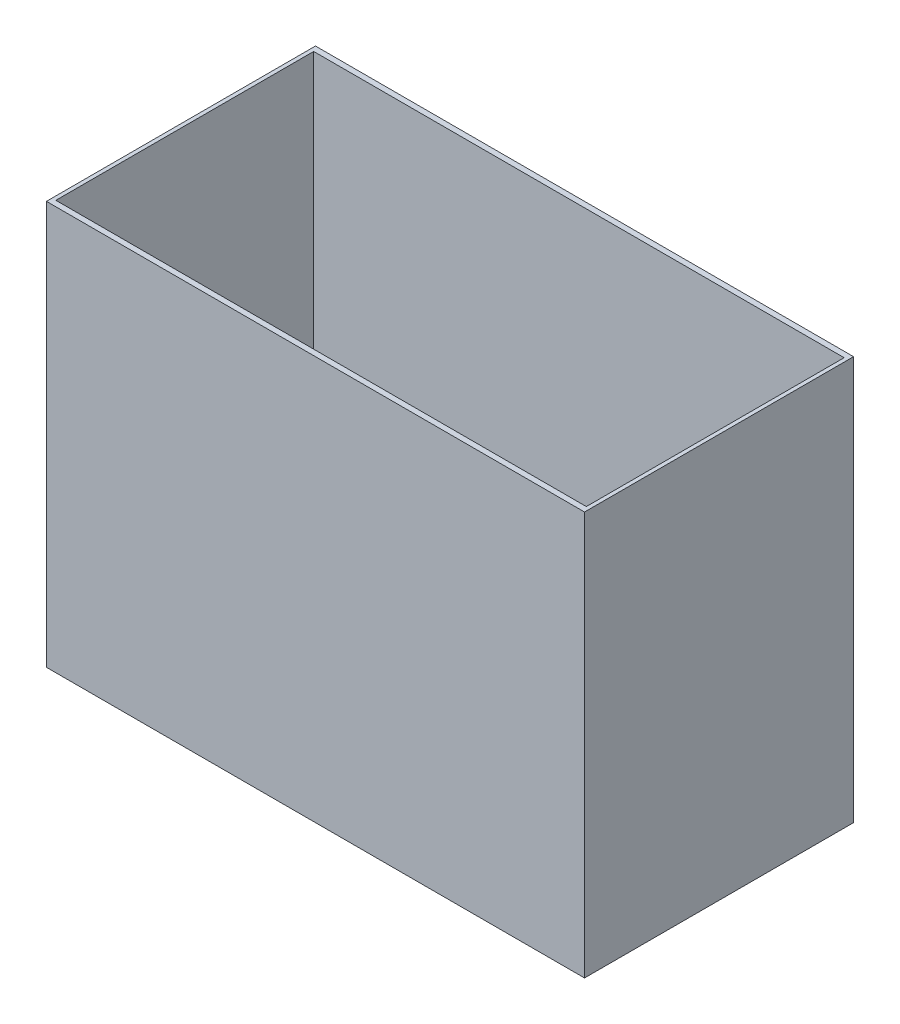
ISO-10303-21;
HEADER;
FILE_DESCRIPTION(('STEP AP214'),'2;1');
FILE_NAME('part.step','',(''),(''),'','','');
FILE_SCHEMA(('AUTOMOTIVE_DESIGN { 1 0 10303 214 1 1 1 1 }'));
ENDSEC;
DATA;
#1=APPLICATION_CONTEXT('core data for automotive mechanical design processes');
#2=APPLICATION_PROTOCOL_DEFINITION('international standard','automotive_design',2000,#1);
#3=PRODUCT_CONTEXT('',#1,'mechanical');
#4=PRODUCT('Part','Part','',(#3));
#5=PRODUCT_RELATED_PRODUCT_CATEGORY('part','',(#4));
#6=PRODUCT_DEFINITION_FORMATION('','',#4);
#7=PRODUCT_DEFINITION_CONTEXT('part definition',#1,'design');
#8=PRODUCT_DEFINITION('design','',#6,#7);
#9=PRODUCT_DEFINITION_SHAPE('','',#8);
#10=(LENGTH_UNIT() NAMED_UNIT(*) SI_UNIT(.MILLI.,.METRE.));
#11=(NAMED_UNIT(*) PLANE_ANGLE_UNIT() SI_UNIT($,.RADIAN.));
#12=(NAMED_UNIT(*) SI_UNIT($,.STERADIAN.) SOLID_ANGLE_UNIT());
#13=UNCERTAINTY_MEASURE_WITH_UNIT(LENGTH_MEASURE(1.E-05),#10,'distance_accuracy_value','');
#14=(GEOMETRIC_REPRESENTATION_CONTEXT(3) GLOBAL_UNCERTAINTY_ASSIGNED_CONTEXT((#13)) GLOBAL_UNIT_ASSIGNED_CONTEXT((#10,
#11,#12)) REPRESENTATION_CONTEXT('',''));
#15=CARTESIAN_POINT('',(0.,0.,0.));
#16=DIRECTION('',(0.,0.,1.));
#17=DIRECTION('',(1.,0.,0.));
#18=AXIS2_PLACEMENT_3D('',#15,#16,#17);
#19=CARTESIAN_POINT('',(0.,457.2,0.));
#20=DIRECTION('',(0.,-1.,0.));
#21=DIRECTION('',(0.,0.,-1.));
#22=AXIS2_PLACEMENT_3D('',#19,#20,#21);
#23=PLANE('',#22);
#24=DIRECTION('',(0.,0.,-1.));
#25=VECTOR('',#24,1.);
#26=CARTESIAN_POINT('',(304.8,457.2,152.4));
#27=LINE('',#26,#25);
#28=CARTESIAN_POINT('',(304.8,457.2,152.4));
#29=VERTEX_POINT('',#28);
#30=CARTESIAN_POINT('',(304.8,457.2,-152.4));
#31=VERTEX_POINT('',#30);
#32=EDGE_CURVE('E151',#29,#31,#27,.T.);
#33=ORIENTED_EDGE('',*,*,#32,.T.);
#34=DIRECTION('',(-1.,0.,0.));
#35=VECTOR('',#34,1.);
#36=CARTESIAN_POINT('',(-304.8,457.2,-152.4));
#37=LINE('',#36,#35);
#38=CARTESIAN_POINT('',(-304.8,457.2,-152.4));
#39=VERTEX_POINT('',#38);
#40=EDGE_CURVE('E154',#31,#39,#37,.T.);
#41=ORIENTED_EDGE('',*,*,#40,.T.);
#42=DIRECTION('',(0.,0.,1.));
#43=VECTOR('',#42,1.);
#44=CARTESIAN_POINT('',(-304.8,457.2,152.4));
#45=LINE('',#44,#43);
#46=CARTESIAN_POINT('',(-304.8,457.2,152.4));
#47=VERTEX_POINT('',#46);
#48=EDGE_CURVE('E157',#39,#47,#45,.T.);
#49=ORIENTED_EDGE('',*,*,#48,.T.);
#50=DIRECTION('',(1.,0.,0.));
#51=VECTOR('',#50,1.);
#52=CARTESIAN_POINT('',(-304.8,457.2,152.4));
#53=LINE('',#52,#51);
#54=EDGE_CURVE('E159',#47,#29,#53,.T.);
#55=ORIENTED_EDGE('',*,*,#54,.T.);
#56=EDGE_LOOP('',(#33,#41,#49,#55));
#57=FACE_BOUND('',#56,.T.);
#58=DIRECTION('',(0.,0.,-1.));
#59=VECTOR('',#58,1.);
#60=CARTESIAN_POINT('',(300.482,457.2,146.05));
#61=LINE('',#60,#59);
#62=CARTESIAN_POINT('',(300.482,457.2,146.05));
#63=VERTEX_POINT('',#62);
#64=CARTESIAN_POINT('',(300.482,457.2,-146.05));
#65=VERTEX_POINT('',#64);
#66=EDGE_CURVE('E115',#63,#65,#61,.T.);
#67=ORIENTED_EDGE('',*,*,#66,.F.);
#68=DIRECTION('',(1.,0.,0.));
#69=VECTOR('',#68,1.);
#70=CARTESIAN_POINT('',(-300.482,457.2,146.05));
#71=LINE('',#70,#69);
#72=CARTESIAN_POINT('',(-300.482,457.2,146.05));
#73=VERTEX_POINT('',#72);
#74=EDGE_CURVE('E137',#73,#63,#71,.T.);
#75=ORIENTED_EDGE('',*,*,#74,.F.);
#76=DIRECTION('',(0.,0.,1.));
#77=VECTOR('',#76,1.);
#78=CARTESIAN_POINT('',(-300.482,457.2,146.05));
#79=LINE('',#78,#77);
#80=CARTESIAN_POINT('',(-300.482,457.2,-146.05));
#81=VERTEX_POINT('',#80);
#82=EDGE_CURVE('E135',#81,#73,#79,.T.);
#83=ORIENTED_EDGE('',*,*,#82,.F.);
#84=DIRECTION('',(-1.,0.,0.));
#85=VECTOR('',#84,1.);
#86=CARTESIAN_POINT('',(-300.482,457.2,-146.05));
#87=LINE('',#86,#85);
#88=EDGE_CURVE('E123',#65,#81,#87,.T.);
#89=ORIENTED_EDGE('',*,*,#88,.F.);
#90=EDGE_LOOP('',(#67,#75,#83,#89));
#91=FACE_BOUND('',#90,.T.);
#92=ADVANCED_FACE('F50',(#57,#91),#23,.F.);
#93=CARTESIAN_POINT('',(0.,0.,0.));
#94=DIRECTION('',(0.,-1.,0.));
#95=DIRECTION('',(0.,0.,-1.));
#96=AXIS2_PLACEMENT_3D('',#93,#94,#95);
#97=PLANE('',#96);
#98=DIRECTION('',(0.,0.,-1.));
#99=VECTOR('',#98,1.);
#100=CARTESIAN_POINT('',(304.8,0.,152.4));
#101=LINE('',#100,#99);
#102=CARTESIAN_POINT('',(304.8,0.,152.4));
#103=VERTEX_POINT('',#102);
#104=CARTESIAN_POINT('',(304.8,0.,-152.4));
#105=VERTEX_POINT('',#104);
#106=EDGE_CURVE('E131',#103,#105,#101,.T.);
#107=ORIENTED_EDGE('',*,*,#106,.F.);
#108=DIRECTION('',(1.,0.,0.));
#109=VECTOR('',#108,1.);
#110=CARTESIAN_POINT('',(-304.8,0.,152.4));
#111=LINE('',#110,#109);
#112=CARTESIAN_POINT('',(-304.8,0.,152.4));
#113=VERTEX_POINT('',#112);
#114=EDGE_CURVE('E155',#113,#103,#111,.T.);
#115=ORIENTED_EDGE('',*,*,#114,.F.);
#116=DIRECTION('',(0.,0.,1.));
#117=VECTOR('',#116,1.);
#118=CARTESIAN_POINT('',(-304.8,0.,152.4));
#119=LINE('',#118,#117);
#120=CARTESIAN_POINT('',(-304.8,0.,-152.4));
#121=VERTEX_POINT('',#120);
#122=EDGE_CURVE('E166',#121,#113,#119,.T.);
#123=ORIENTED_EDGE('',*,*,#122,.F.);
#124=DIRECTION('',(-1.,0.,0.));
#125=VECTOR('',#124,1.);
#126=CARTESIAN_POINT('',(-304.8,0.,-152.4));
#127=LINE('',#126,#125);
#128=EDGE_CURVE('E164',#105,#121,#127,.T.);
#129=ORIENTED_EDGE('',*,*,#128,.F.);
#130=EDGE_LOOP('',(#107,#115,#123,#129));
#131=FACE_BOUND('',#130,.T.);
#132=DIRECTION('',(1.,0.,0.));
#133=VECTOR('',#132,1.);
#134=CARTESIAN_POINT('',(-300.482,0.,146.05));
#135=LINE('',#134,#133);
#136=CARTESIAN_POINT('',(-300.482,0.,146.05));
#137=VERTEX_POINT('',#136);
#138=CARTESIAN_POINT('',(300.482,0.,146.05));
#139=VERTEX_POINT('',#138);
#140=EDGE_CURVE('E124',#137,#139,#135,.T.);
#141=ORIENTED_EDGE('',*,*,#140,.T.);
#142=DIRECTION('',(0.,0.,-1.));
#143=VECTOR('',#142,1.);
#144=CARTESIAN_POINT('',(300.482,0.,146.05));
#145=LINE('',#144,#143);
#146=CARTESIAN_POINT('',(300.482,0.,-146.05));
#147=VERTEX_POINT('',#146);
#148=EDGE_CURVE('E73',#139,#147,#145,.T.);
#149=ORIENTED_EDGE('',*,*,#148,.T.);
#150=DIRECTION('',(-1.,0.,0.));
#151=VECTOR('',#150,1.);
#152=CARTESIAN_POINT('',(-300.482,0.,-146.05));
#153=LINE('',#152,#151);
#154=CARTESIAN_POINT('',(-300.482,0.,-146.05));
#155=VERTEX_POINT('',#154);
#156=EDGE_CURVE('E130',#147,#155,#153,.T.);
#157=ORIENTED_EDGE('',*,*,#156,.T.);
#158=DIRECTION('',(0.,0.,1.));
#159=VECTOR('',#158,1.);
#160=CARTESIAN_POINT('',(-300.482,0.,146.05));
#161=LINE('',#160,#159);
#162=EDGE_CURVE('E143',#155,#137,#161,.T.);
#163=ORIENTED_EDGE('',*,*,#162,.T.);
#164=EDGE_LOOP('',(#141,#149,#157,#163));
#165=FACE_BOUND('',#164,.T.);
#166=ADVANCED_FACE('F184',(#131,#165),#97,.T.);
#167=CARTESIAN_POINT('',(304.8,457.2,152.4));
#168=DIRECTION('',(-1.,0.,0.));
#169=DIRECTION('',(0.,0.,1.));
#170=AXIS2_PLACEMENT_3D('',#167,#168,#169);
#171=PLANE('',#170);
#172=ORIENTED_EDGE('',*,*,#106,.T.);
#173=DIRECTION('',(0.,-1.,0.));
#174=VECTOR('',#173,1.);
#175=CARTESIAN_POINT('',(304.8,457.2,-152.4));
#176=LINE('',#175,#174);
#177=EDGE_CURVE('E12',#31,#105,#176,.T.);
#178=ORIENTED_EDGE('',*,*,#177,.F.);
#179=ORIENTED_EDGE('',*,*,#32,.F.);
#180=DIRECTION('',(0.,-1.,0.));
#181=VECTOR('',#180,1.);
#182=CARTESIAN_POINT('',(304.8,457.2,152.4));
#183=LINE('',#182,#181);
#184=EDGE_CURVE('E161',#29,#103,#183,.T.);
#185=ORIENTED_EDGE('',*,*,#184,.T.);
#186=EDGE_LOOP('',(#172,#178,#179,#185));
#187=FACE_BOUND('',#186,.T.);
#188=ADVANCED_FACE('F52',(#187),#171,.F.);
#189=CARTESIAN_POINT('',(-304.8,457.2,-152.4));
#190=DIRECTION('',(0.,0.,1.));
#191=DIRECTION('',(1.,0.,0.));
#192=AXIS2_PLACEMENT_3D('',#189,#190,#191);
#193=PLANE('',#192);
#194=ORIENTED_EDGE('',*,*,#128,.T.);
#195=DIRECTION('',(0.,-1.,0.));
#196=VECTOR('',#195,1.);
#197=CARTESIAN_POINT('',(-304.8,457.2,-152.4));
#198=LINE('',#197,#196);
#199=EDGE_CURVE('E58',#39,#121,#198,.T.);
#200=ORIENTED_EDGE('',*,*,#199,.F.);
#201=ORIENTED_EDGE('',*,*,#40,.F.);
#202=ORIENTED_EDGE('',*,*,#177,.T.);
#203=EDGE_LOOP('',(#194,#200,#201,#202));
#204=FACE_BOUND('',#203,.T.);
#205=ADVANCED_FACE('F194',(#204),#193,.F.);
#206=CARTESIAN_POINT('',(-304.8,457.2,152.4));
#207=DIRECTION('',(1.,0.,0.));
#208=DIRECTION('',(0.,0.,-1.));
#209=AXIS2_PLACEMENT_3D('',#206,#207,#208);
#210=PLANE('',#209);
#211=ORIENTED_EDGE('',*,*,#122,.T.);
#212=DIRECTION('',(0.,-1.,0.));
#213=VECTOR('',#212,1.);
#214=CARTESIAN_POINT('',(-304.8,457.2,152.4));
#215=LINE('',#214,#213);
#216=EDGE_CURVE('E171',#47,#113,#215,.T.);
#217=ORIENTED_EDGE('',*,*,#216,.F.);
#218=ORIENTED_EDGE('',*,*,#48,.F.);
#219=ORIENTED_EDGE('',*,*,#199,.T.);
#220=EDGE_LOOP('',(#211,#217,#218,#219));
#221=FACE_BOUND('',#220,.T.);
#222=ADVANCED_FACE('F178',(#221),#210,.F.);
#223=CARTESIAN_POINT('',(-304.8,457.2,152.4));
#224=DIRECTION('',(0.,0.,-1.));
#225=DIRECTION('',(-1.,0.,0.));
#226=AXIS2_PLACEMENT_3D('',#223,#224,#225);
#227=PLANE('',#226);
#228=ORIENTED_EDGE('',*,*,#114,.T.);
#229=ORIENTED_EDGE('',*,*,#184,.F.);
#230=ORIENTED_EDGE('',*,*,#54,.F.);
#231=ORIENTED_EDGE('',*,*,#216,.T.);
#232=EDGE_LOOP('',(#228,#229,#230,#231));
#233=FACE_BOUND('',#232,.T.);
#234=ADVANCED_FACE('F188',(#233),#227,.F.);
#235=CARTESIAN_POINT('',(300.482,457.2,146.05));
#236=DIRECTION('',(-1.,0.,0.));
#237=DIRECTION('',(0.,0.,1.));
#238=AXIS2_PLACEMENT_3D('',#235,#236,#237);
#239=PLANE('',#238);
#240=ORIENTED_EDGE('',*,*,#148,.F.);
#241=DIRECTION('',(0.,-1.,0.));
#242=VECTOR('',#241,1.);
#243=CARTESIAN_POINT('',(300.482,457.2,146.05));
#244=LINE('',#243,#242);
#245=EDGE_CURVE('E119',#63,#139,#244,.T.);
#246=ORIENTED_EDGE('',*,*,#245,.F.);
#247=ORIENTED_EDGE('',*,*,#66,.T.);
#248=DIRECTION('',(0.,-1.,0.));
#249=VECTOR('',#248,1.);
#250=CARTESIAN_POINT('',(300.482,457.2,-146.05));
#251=LINE('',#250,#249);
#252=EDGE_CURVE('E118',#65,#147,#251,.T.);
#253=ORIENTED_EDGE('',*,*,#252,.T.);
#254=EDGE_LOOP('',(#240,#246,#247,#253));
#255=FACE_BOUND('',#254,.T.);
#256=ADVANCED_FACE('F117',(#255),#239,.T.);
#257=CARTESIAN_POINT('',(-300.482,457.2,-146.05));
#258=DIRECTION('',(0.,0.,1.));
#259=DIRECTION('',(1.,0.,0.));
#260=AXIS2_PLACEMENT_3D('',#257,#258,#259);
#261=PLANE('',#260);
#262=ORIENTED_EDGE('',*,*,#156,.F.);
#263=ORIENTED_EDGE('',*,*,#252,.F.);
#264=ORIENTED_EDGE('',*,*,#88,.T.);
#265=DIRECTION('',(0.,-1.,0.));
#266=VECTOR('',#265,1.);
#267=CARTESIAN_POINT('',(-300.482,457.2,-146.05));
#268=LINE('',#267,#266);
#269=EDGE_CURVE('E132',#81,#155,#268,.T.);
#270=ORIENTED_EDGE('',*,*,#269,.T.);
#271=EDGE_LOOP('',(#262,#263,#264,#270));
#272=FACE_BOUND('',#271,.T.);
#273=ADVANCED_FACE('F127',(#272),#261,.T.);
#274=CARTESIAN_POINT('',(-300.482,457.2,146.05));
#275=DIRECTION('',(1.,0.,0.));
#276=DIRECTION('',(0.,0.,-1.));
#277=AXIS2_PLACEMENT_3D('',#274,#275,#276);
#278=PLANE('',#277);
#279=ORIENTED_EDGE('',*,*,#162,.F.);
#280=ORIENTED_EDGE('',*,*,#269,.F.);
#281=ORIENTED_EDGE('',*,*,#82,.T.);
#282=DIRECTION('',(0.,-1.,0.));
#283=VECTOR('',#282,1.);
#284=CARTESIAN_POINT('',(-300.482,457.2,146.05));
#285=LINE('',#284,#283);
#286=EDGE_CURVE('E65',#73,#137,#285,.T.);
#287=ORIENTED_EDGE('',*,*,#286,.T.);
#288=EDGE_LOOP('',(#279,#280,#281,#287));
#289=FACE_BOUND('',#288,.T.);
#290=ADVANCED_FACE('F217',(#289),#278,.T.);
#291=CARTESIAN_POINT('',(-300.482,457.2,146.05));
#292=DIRECTION('',(0.,0.,-1.));
#293=DIRECTION('',(-1.,0.,0.));
#294=AXIS2_PLACEMENT_3D('',#291,#292,#293);
#295=PLANE('',#294);
#296=ORIENTED_EDGE('',*,*,#140,.F.);
#297=ORIENTED_EDGE('',*,*,#286,.F.);
#298=ORIENTED_EDGE('',*,*,#74,.T.);
#299=ORIENTED_EDGE('',*,*,#245,.T.);
#300=EDGE_LOOP('',(#296,#297,#298,#299));
#301=FACE_BOUND('',#300,.T.);
#302=ADVANCED_FACE('F221',(#301),#295,.T.);
#303=CLOSED_SHELL('',(#92,#166,#188,#205,#222,#234,#256,#273,#290,#302));
#304=MANIFOLD_SOLID_BREP('B2_NOT_SHOWN',#303);
#305=CARTESIAN_POINT('',(292.1,6.35,-139.7));
#306=DIRECTION('',(-1.,0.,0.));
#307=DIRECTION('',(0.,0.,1.));
#308=AXIS2_PLACEMENT_3D('',#305,#306,#307);
#309=PLANE('',#308);
#310=DIRECTION('',(0.,0.,-1.));
#311=VECTOR('',#310,1.);
#312=CARTESIAN_POINT('',(292.1,0.,-139.7));
#313=LINE('',#312,#311);
#314=CARTESIAN_POINT('',(292.1,0.,139.7));
#315=VERTEX_POINT('',#314);
#316=CARTESIAN_POINT('',(292.1,0.,104.14));
#317=VERTEX_POINT('',#316);
#318=EDGE_CURVE('E550',#315,#317,#313,.T.);
#319=ORIENTED_EDGE('',*,*,#318,.T.);
#320=DIRECTION('',(0.,1.,0.));
#321=VECTOR('',#320,1.);
#322=CARTESIAN_POINT('',(292.1,0.,104.14));
#323=LINE('',#322,#321);
#324=CARTESIAN_POINT('',(292.1,6.35,104.14));
#325=VERTEX_POINT('',#324);
#326=EDGE_CURVE('E488',#317,#325,#323,.T.);
#327=ORIENTED_EDGE('',*,*,#326,.T.);
#328=DIRECTION('',(0.,0.,-1.));
#329=VECTOR('',#328,1.);
#330=CARTESIAN_POINT('',(292.1,6.35,-139.7));
#331=LINE('',#330,#329);
#332=CARTESIAN_POINT('',(292.1,6.35,139.7));
#333=VERTEX_POINT('',#332);
#334=EDGE_CURVE('E539',#333,#325,#331,.T.);
#335=ORIENTED_EDGE('',*,*,#334,.F.);
#336=DIRECTION('',(0.,-1.,0.));
#337=VECTOR('',#336,1.);
#338=CARTESIAN_POINT('',(292.1,6.35,139.7));
#339=LINE('',#338,#337);
#340=EDGE_CURVE('E549',#333,#315,#339,.T.);
#341=ORIENTED_EDGE('',*,*,#340,.T.);
#342=EDGE_LOOP('',(#319,#327,#335,#341));
#343=FACE_BOUND('',#342,.T.);
#344=ADVANCED_FACE('F279',(#343),#309,.F.);
#345=CARTESIAN_POINT('',(292.1,6.35,17.78));
#346=VERTEX_POINT('',#345);
#347=CARTESIAN_POINT('',(292.1,6.35,-17.78));
#348=VERTEX_POINT('',#347);
#349=EDGE_CURVE('E619',#346,#348,#331,.T.);
#350=ORIENTED_EDGE('',*,*,#349,.F.);
#351=DIRECTION('',(0.,1.,0.));
#352=VECTOR('',#351,1.);
#353=CARTESIAN_POINT('',(292.1,0.,17.78));
#354=LINE('',#353,#352);
#355=CARTESIAN_POINT('',(292.1,0.,17.78));
#356=VERTEX_POINT('',#355);
#357=EDGE_CURVE('E464',#356,#346,#354,.T.);
#358=ORIENTED_EDGE('',*,*,#357,.F.);
#359=CARTESIAN_POINT('',(292.1,0.,-17.78));
#360=VERTEX_POINT('',#359);
#361=EDGE_CURVE('E596',#356,#360,#313,.T.);
#362=ORIENTED_EDGE('',*,*,#361,.T.);
#363=DIRECTION('',(0.,1.,0.));
#364=VECTOR('',#363,1.);
#365=CARTESIAN_POINT('',(292.1,0.,-17.78));
#366=LINE('',#365,#364);
#367=EDGE_CURVE('E518',#360,#348,#366,.T.);
#368=ORIENTED_EDGE('',*,*,#367,.T.);
#369=EDGE_LOOP('',(#350,#358,#362,#368));
#370=FACE_BOUND('',#369,.T.);
#371=ADVANCED_FACE('F624',(#370),#309,.F.);
#372=CARTESIAN_POINT('',(292.1,0.,-43.18));
#373=VERTEX_POINT('',#372);
#374=CARTESIAN_POINT('',(292.1,0.,-78.74));
#375=VERTEX_POINT('',#374);
#376=EDGE_CURVE('E594',#373,#375,#313,.T.);
#377=ORIENTED_EDGE('',*,*,#376,.T.);
#378=DIRECTION('',(0.,1.,0.));
#379=VECTOR('',#378,1.);
#380=CARTESIAN_POINT('',(292.1,0.,-78.74));
#381=LINE('',#380,#379);
#382=CARTESIAN_POINT('',(292.1,6.35,-78.74));
#383=VERTEX_POINT('',#382);
#384=EDGE_CURVE('E453',#375,#383,#381,.T.);
#385=ORIENTED_EDGE('',*,*,#384,.T.);
#386=CARTESIAN_POINT('',(292.1,6.35,-43.18));
#387=VERTEX_POINT('',#386);
#388=EDGE_CURVE('E442',#387,#383,#331,.T.);
#389=ORIENTED_EDGE('',*,*,#388,.F.);
#390=DIRECTION('',(0.,1.,0.));
#391=VECTOR('',#390,1.);
#392=CARTESIAN_POINT('',(292.1,0.,-43.18));
#393=LINE('',#392,#391);
#394=EDGE_CURVE('E513',#373,#387,#393,.T.);
#395=ORIENTED_EDGE('',*,*,#394,.F.);
#396=EDGE_LOOP('',(#377,#385,#389,#395));
#397=FACE_BOUND('',#396,.T.);
#398=ADVANCED_FACE('F633',(#397),#309,.F.);
#399=CARTESIAN_POINT('',(292.1,6.35,78.74));
#400=VERTEX_POINT('',#399);
#401=CARTESIAN_POINT('',(292.1,6.35,43.18));
#402=VERTEX_POINT('',#401);
#403=EDGE_CURVE('E542',#400,#402,#331,.T.);
#404=ORIENTED_EDGE('',*,*,#403,.F.);
#405=DIRECTION('',(0.,1.,0.));
#406=VECTOR('',#405,1.);
#407=CARTESIAN_POINT('',(292.1,0.,78.74));
#408=LINE('',#407,#406);
#409=CARTESIAN_POINT('',(292.1,0.,78.74));
#410=VERTEX_POINT('',#409);
#411=EDGE_CURVE('E481',#410,#400,#408,.T.);
#412=ORIENTED_EDGE('',*,*,#411,.F.);
#413=CARTESIAN_POINT('',(292.1,0.,43.18));
#414=VERTEX_POINT('',#413);
#415=EDGE_CURVE('E554',#410,#414,#313,.T.);
#416=ORIENTED_EDGE('',*,*,#415,.T.);
#417=DIRECTION('',(0.,1.,0.));
#418=VECTOR('',#417,1.);
#419=CARTESIAN_POINT('',(292.1,0.,43.18));
#420=LINE('',#419,#418);
#421=EDGE_CURVE('E461',#414,#402,#420,.T.);
#422=ORIENTED_EDGE('',*,*,#421,.T.);
#423=EDGE_LOOP('',(#404,#412,#416,#422));
#424=FACE_BOUND('',#423,.T.);
#425=ADVANCED_FACE('F609',(#424),#309,.F.);
#426=CARTESIAN_POINT('',(292.1,6.35,-104.14));
#427=VERTEX_POINT('',#426);
#428=CARTESIAN_POINT('',(292.1,6.35,-139.7));
#429=VERTEX_POINT('',#428);
#430=EDGE_CURVE('E543',#427,#429,#331,.T.);
#431=ORIENTED_EDGE('',*,*,#430,.F.);
#432=DIRECTION('',(0.,1.,0.));
#433=VECTOR('',#432,1.);
#434=CARTESIAN_POINT('',(292.1,0.,-104.14));
#435=LINE('',#434,#433);
#436=CARTESIAN_POINT('',(292.1,0.,-104.14));
#437=VERTEX_POINT('',#436);
#438=EDGE_CURVE('E593',#437,#427,#435,.T.);
#439=ORIENTED_EDGE('',*,*,#438,.F.);
#440=CARTESIAN_POINT('',(292.1,0.,-139.7));
#441=VERTEX_POINT('',#440);
#442=EDGE_CURVE('E536',#437,#441,#313,.T.);
#443=ORIENTED_EDGE('',*,*,#442,.T.);
#444=DIRECTION('',(0.,-1.,0.));
#445=VECTOR('',#444,1.);
#446=CARTESIAN_POINT('',(292.1,6.35,-139.7));
#447=LINE('',#446,#445);
#448=EDGE_CURVE('E48',#429,#441,#447,.T.);
#449=ORIENTED_EDGE('',*,*,#448,.F.);
#450=EDGE_LOOP('',(#431,#439,#443,#449));
#451=FACE_BOUND('',#450,.T.);
#452=ADVANCED_FACE('F281',(#451),#309,.F.);
#453=CARTESIAN_POINT('',(292.1,6.35,-139.7));
#454=DIRECTION('',(0.,0.,1.));
#455=DIRECTION('',(1.,0.,0.));
#456=AXIS2_PLACEMENT_3D('',#453,#454,#455);
#457=PLANE('',#456);
#458=DIRECTION('',(-1.,0.,0.));
#459=VECTOR('',#458,1.);
#460=CARTESIAN_POINT('',(292.1,0.,-139.7));
#461=LINE('',#460,#459);
#462=CARTESIAN_POINT('',(165.1,0.,-139.7));
#463=VERTEX_POINT('',#462);
#464=EDGE_CURVE('E553',#441,#463,#461,.T.);
#465=ORIENTED_EDGE('',*,*,#464,.T.);
#466=DIRECTION('',(0.,-1.,0.));
#467=VECTOR('',#466,1.);
#468=CARTESIAN_POINT('',(165.1,6.35,-139.7));
#469=LINE('',#468,#467);
#470=CARTESIAN_POINT('',(165.1,6.35,-139.7));
#471=VERTEX_POINT('',#470);
#472=EDGE_CURVE('E287',#471,#463,#469,.T.);
#473=ORIENTED_EDGE('',*,*,#472,.F.);
#474=DIRECTION('',(-1.,0.,0.));
#475=VECTOR('',#474,1.);
#476=CARTESIAN_POINT('',(292.1,6.35,-139.7));
#477=LINE('',#476,#475);
#478=EDGE_CURVE('E541',#429,#471,#477,.T.);
#479=ORIENTED_EDGE('',*,*,#478,.F.);
#480=ORIENTED_EDGE('',*,*,#448,.T.);
#481=EDGE_LOOP('',(#465,#473,#479,#480));
#482=FACE_BOUND('',#481,.T.);
#483=ADVANCED_FACE('F590',(#482),#457,.F.);
#484=CARTESIAN_POINT('',(165.1,6.35,-139.7));
#485=DIRECTION('',(1.,0.,0.));
#486=DIRECTION('',(0.,0.,-1.));
#487=AXIS2_PLACEMENT_3D('',#484,#485,#486);
#488=PLANE('',#487);
#489=DIRECTION('',(0.,0.,1.));
#490=VECTOR('',#489,1.);
#491=CARTESIAN_POINT('',(165.1,0.,-139.7));
#492=LINE('',#491,#490);
#493=CARTESIAN_POINT('',(165.1,0.,139.7));
#494=VERTEX_POINT('',#493);
#495=EDGE_CURVE('E556',#463,#494,#492,.T.);
#496=ORIENTED_EDGE('',*,*,#495,.T.);
#497=DIRECTION('',(0.,-1.,0.));
#498=VECTOR('',#497,1.);
#499=CARTESIAN_POINT('',(165.1,6.35,139.7));
#500=LINE('',#499,#498);
#501=CARTESIAN_POINT('',(165.1,6.35,139.7));
#502=VERTEX_POINT('',#501);
#503=EDGE_CURVE('E562',#502,#494,#500,.T.);
#504=ORIENTED_EDGE('',*,*,#503,.F.);
#505=DIRECTION('',(0.,0.,1.));
#506=VECTOR('',#505,1.);
#507=CARTESIAN_POINT('',(165.1,6.35,-139.7));
#508=LINE('',#507,#506);
#509=EDGE_CURVE('E545',#471,#502,#508,.T.);
#510=ORIENTED_EDGE('',*,*,#509,.F.);
#511=ORIENTED_EDGE('',*,*,#472,.T.);
#512=EDGE_LOOP('',(#496,#504,#510,#511));
#513=FACE_BOUND('',#512,.T.);
#514=ADVANCED_FACE('F569',(#513),#488,.F.);
#515=CARTESIAN_POINT('',(292.1,6.35,139.7));
#516=DIRECTION('',(0.,0.,-1.));
#517=DIRECTION('',(-1.,0.,0.));
#518=AXIS2_PLACEMENT_3D('',#515,#516,#517);
#519=PLANE('',#518);
#520=DIRECTION('',(1.,0.,0.));
#521=VECTOR('',#520,1.);
#522=CARTESIAN_POINT('',(292.1,0.,139.7));
#523=LINE('',#522,#521);
#524=EDGE_CURVE('E558',#494,#315,#523,.T.);
#525=ORIENTED_EDGE('',*,*,#524,.T.);
#526=ORIENTED_EDGE('',*,*,#340,.F.);
#527=DIRECTION('',(1.,0.,0.));
#528=VECTOR('',#527,1.);
#529=CARTESIAN_POINT('',(292.1,6.35,139.7));
#530=LINE('',#529,#528);
#531=EDGE_CURVE('E547',#502,#333,#530,.T.);
#532=ORIENTED_EDGE('',*,*,#531,.F.);
#533=ORIENTED_EDGE('',*,*,#503,.T.);
#534=EDGE_LOOP('',(#525,#526,#532,#533));
#535=FACE_BOUND('',#534,.T.);
#536=ADVANCED_FACE('F582',(#535),#519,.F.);
#537=CARTESIAN_POINT('',(0.,6.35,0.));
#538=DIRECTION('',(0.,-1.,0.));
#539=DIRECTION('',(0.,0.,-1.));
#540=AXIS2_PLACEMENT_3D('',#537,#538,#539);
#541=PLANE('',#540);
#542=CARTESIAN_POINT('',(252.011899962999,6.35,99.6118999630009));
#543=DIRECTION('',(0.,-1.,0.));
#544=DIRECTION('',(0.,0.,-1.));
#545=AXIS2_PLACEMENT_3D('',#542,#543,#544);
#546=CIRCLE('',#545,21.038100037);
#547=CARTESIAN_POINT('',(252.011899962999,6.35,78.5737999260008));
#548=VERTEX_POINT('',#547);
#549=EDGE_CURVE('E521',#548,#548,#546,.T.);
#550=ORIENTED_EDGE('',*,*,#549,.T.);
#551=EDGE_LOOP('',(#550));
#552=FACE_BOUND('',#551,.T.);
#553=CARTESIAN_POINT('',(252.011899962999,6.35,-99.6118999630009));
#554=DIRECTION('',(0.,1.,0.));
#555=DIRECTION('',(0.,0.,1.));
#556=AXIS2_PLACEMENT_3D('',#553,#554,#555);
#557=CIRCLE('',#556,21.038100037);
#558=CARTESIAN_POINT('',(252.011899962999,6.35,-78.5737999260008));
#559=VERTEX_POINT('',#558);
#560=EDGE_CURVE('E530',#559,#559,#557,.T.);
#561=ORIENTED_EDGE('',*,*,#560,.F.);
#562=EDGE_LOOP('',(#561));
#563=FACE_BOUND('',#562,.T.);
#564=ORIENTED_EDGE('',*,*,#334,.T.);
#565=DIRECTION('',(1.,0.,0.));
#566=VECTOR('',#565,1.);
#567=CARTESIAN_POINT('',(292.1,6.35,104.14));
#568=LINE('',#567,#566);
#569=CARTESIAN_POINT('',(285.75,6.35,104.14));
#570=VERTEX_POINT('',#569);
#571=EDGE_CURVE('E491',#570,#325,#568,.T.);
#572=ORIENTED_EDGE('',*,*,#571,.F.);
#573=DIRECTION('',(0.,0.,1.));
#574=VECTOR('',#573,1.);
#575=CARTESIAN_POINT('',(285.75,6.35,78.74));
#576=LINE('',#575,#574);
#577=CARTESIAN_POINT('',(285.75,6.35,78.74));
#578=VERTEX_POINT('',#577);
#579=EDGE_CURVE('E493',#578,#570,#576,.T.);
#580=ORIENTED_EDGE('',*,*,#579,.F.);
#581=DIRECTION('',(-1.,0.,0.));
#582=VECTOR('',#581,1.);
#583=CARTESIAN_POINT('',(292.1,6.35,78.74));
#584=LINE('',#583,#582);
#585=EDGE_CURVE('E466',#400,#578,#584,.T.);
#586=ORIENTED_EDGE('',*,*,#585,.F.);
#587=ORIENTED_EDGE('',*,*,#403,.T.);
#588=DIRECTION('',(1.,0.,0.));
#589=VECTOR('',#588,1.);
#590=CARTESIAN_POINT('',(292.1,6.35,43.18));
#591=LINE('',#590,#589);
#592=CARTESIAN_POINT('',(285.75,6.35,43.18));
#593=VERTEX_POINT('',#592);
#594=EDGE_CURVE('E467',#593,#402,#591,.T.);
#595=ORIENTED_EDGE('',*,*,#594,.F.);
#596=DIRECTION('',(0.,0.,1.));
#597=VECTOR('',#596,1.);
#598=CARTESIAN_POINT('',(285.75,6.35,43.18));
#599=LINE('',#598,#597);
#600=CARTESIAN_POINT('',(285.75,6.35,17.78));
#601=VERTEX_POINT('',#600);
#602=EDGE_CURVE('E469',#601,#593,#599,.T.);
#603=ORIENTED_EDGE('',*,*,#602,.F.);
#604=DIRECTION('',(-1.,0.,0.));
#605=VECTOR('',#604,1.);
#606=CARTESIAN_POINT('',(292.1,6.35,17.78));
#607=LINE('',#606,#605);
#608=EDGE_CURVE('E426',#346,#601,#607,.T.);
#609=ORIENTED_EDGE('',*,*,#608,.F.);
#610=ORIENTED_EDGE('',*,*,#349,.T.);
#611=DIRECTION('',(1.,0.,0.));
#612=VECTOR('',#611,1.);
#613=CARTESIAN_POINT('',(292.1,6.35,-17.78));
#614=LINE('',#613,#612);
#615=CARTESIAN_POINT('',(285.75,6.35,-17.78));
#616=VERTEX_POINT('',#615);
#617=EDGE_CURVE('E508',#616,#348,#614,.T.);
#618=ORIENTED_EDGE('',*,*,#617,.F.);
#619=DIRECTION('',(0.,0.,1.));
#620=VECTOR('',#619,1.);
#621=CARTESIAN_POINT('',(285.75,6.35,-43.18));
#622=LINE('',#621,#620);
#623=CARTESIAN_POINT('',(285.75,6.35,-43.18));
#624=VERTEX_POINT('',#623);
#625=EDGE_CURVE('E446',#624,#616,#622,.T.);
#626=ORIENTED_EDGE('',*,*,#625,.F.);
#627=DIRECTION('',(-1.,0.,0.));
#628=VECTOR('',#627,1.);
#629=CARTESIAN_POINT('',(292.1,6.35,-43.18));
#630=LINE('',#629,#628);
#631=EDGE_CURVE('E443',#387,#624,#630,.T.);
#632=ORIENTED_EDGE('',*,*,#631,.F.);
#633=ORIENTED_EDGE('',*,*,#388,.T.);
#634=DIRECTION('',(1.,0.,0.));
#635=VECTOR('',#634,1.);
#636=CARTESIAN_POINT('',(292.1,6.35,-78.74));
#637=LINE('',#636,#635);
#638=CARTESIAN_POINT('',(285.75,6.35,-78.74));
#639=VERTEX_POINT('',#638);
#640=EDGE_CURVE('E419',#639,#383,#637,.T.);
#641=ORIENTED_EDGE('',*,*,#640,.F.);
#642=DIRECTION('',(0.,0.,1.));
#643=VECTOR('',#642,1.);
#644=CARTESIAN_POINT('',(285.75,6.35,-78.74));
#645=LINE('',#644,#643);
#646=CARTESIAN_POINT('',(285.75,6.35,-104.14));
#647=VERTEX_POINT('',#646);
#648=EDGE_CURVE('E429',#647,#639,#645,.T.);
#649=ORIENTED_EDGE('',*,*,#648,.F.);
#650=DIRECTION('',(-1.,0.,0.));
#651=VECTOR('',#650,1.);
#652=CARTESIAN_POINT('',(292.1,6.35,-104.14));
#653=LINE('',#652,#651);
#654=EDGE_CURVE('E435',#427,#647,#653,.T.);
#655=ORIENTED_EDGE('',*,*,#654,.F.);
#656=ORIENTED_EDGE('',*,*,#430,.T.);
#657=ORIENTED_EDGE('',*,*,#478,.T.);
#658=ORIENTED_EDGE('',*,*,#509,.T.);
#659=ORIENTED_EDGE('',*,*,#531,.T.);
#660=EDGE_LOOP('',(#564,#572,#580,#586,#587,#595,#603,#609,#610,#618,#626,#632,#633,#641,#649,
#655,#656,#657,#658,#659));
#661=FACE_BOUND('',#660,.T.);
#662=ADVANCED_FACE('F439',(#552,#563,#661),#541,.F.);
#663=CARTESIAN_POINT('',(0.,0.,0.));
#664=DIRECTION('',(0.,-1.,0.));
#665=DIRECTION('',(0.,0.,-1.));
#666=AXIS2_PLACEMENT_3D('',#663,#664,#665);
#667=PLANE('',#666);
#668=DIRECTION('',(1.,0.,0.));
#669=VECTOR('',#668,1.);
#670=CARTESIAN_POINT('',(292.1,0.,104.14));
#671=LINE('',#670,#669);
#672=CARTESIAN_POINT('',(285.75,0.,104.14));
#673=VERTEX_POINT('',#672);
#674=EDGE_CURVE('E483',#673,#317,#671,.T.);
#675=ORIENTED_EDGE('',*,*,#674,.T.);
#676=ORIENTED_EDGE('',*,*,#318,.F.);
#677=ORIENTED_EDGE('',*,*,#524,.F.);
#678=ORIENTED_EDGE('',*,*,#495,.F.);
#679=ORIENTED_EDGE('',*,*,#464,.F.);
#680=ORIENTED_EDGE('',*,*,#442,.F.);
#681=DIRECTION('',(-1.,0.,0.));
#682=VECTOR('',#681,1.);
#683=CARTESIAN_POINT('',(292.1,0.,-104.14));
#684=LINE('',#683,#682);
#685=CARTESIAN_POINT('',(285.75,0.,-104.14));
#686=VERTEX_POINT('',#685);
#687=EDGE_CURVE('E452',#437,#686,#684,.T.);
#688=ORIENTED_EDGE('',*,*,#687,.T.);
#689=DIRECTION('',(0.,0.,1.));
#690=VECTOR('',#689,1.);
#691=CARTESIAN_POINT('',(285.75,0.,-78.74));
#692=LINE('',#691,#690);
#693=CARTESIAN_POINT('',(285.75,0.,-78.74));
#694=VERTEX_POINT('',#693);
#695=EDGE_CURVE('E450',#686,#694,#692,.T.);
#696=ORIENTED_EDGE('',*,*,#695,.T.);
#697=DIRECTION('',(1.,0.,0.));
#698=VECTOR('',#697,1.);
#699=CARTESIAN_POINT('',(292.1,0.,-78.74));
#700=LINE('',#699,#698);
#701=EDGE_CURVE('E422',#694,#375,#700,.T.);
#702=ORIENTED_EDGE('',*,*,#701,.T.);
#703=ORIENTED_EDGE('',*,*,#376,.F.);
#704=DIRECTION('',(-1.,0.,0.));
#705=VECTOR('',#704,1.);
#706=CARTESIAN_POINT('',(292.1,0.,-43.18));
#707=LINE('',#706,#705);
#708=CARTESIAN_POINT('',(285.75,0.,-43.18));
#709=VERTEX_POINT('',#708);
#710=EDGE_CURVE('E504',#373,#709,#707,.T.);
#711=ORIENTED_EDGE('',*,*,#710,.T.);
#712=DIRECTION('',(0.,0.,1.));
#713=VECTOR('',#712,1.);
#714=CARTESIAN_POINT('',(285.75,0.,-43.18));
#715=LINE('',#714,#713);
#716=CARTESIAN_POINT('',(285.75,0.,-17.78));
#717=VERTEX_POINT('',#716);
#718=EDGE_CURVE('E507',#709,#717,#715,.T.);
#719=ORIENTED_EDGE('',*,*,#718,.T.);
#720=DIRECTION('',(1.,0.,0.));
#721=VECTOR('',#720,1.);
#722=CARTESIAN_POINT('',(292.1,0.,-17.78));
#723=LINE('',#722,#721);
#724=EDGE_CURVE('E511',#717,#360,#723,.T.);
#725=ORIENTED_EDGE('',*,*,#724,.T.);
#726=ORIENTED_EDGE('',*,*,#361,.F.);
#727=DIRECTION('',(-1.,0.,0.));
#728=VECTOR('',#727,1.);
#729=CARTESIAN_POINT('',(292.1,0.,17.78));
#730=LINE('',#729,#728);
#731=CARTESIAN_POINT('',(285.75,0.,17.78));
#732=VERTEX_POINT('',#731);
#733=EDGE_CURVE('E470',#356,#732,#730,.T.);
#734=ORIENTED_EDGE('',*,*,#733,.T.);
#735=DIRECTION('',(0.,0.,1.));
#736=VECTOR('',#735,1.);
#737=CARTESIAN_POINT('',(285.75,0.,43.18));
#738=LINE('',#737,#736);
#739=CARTESIAN_POINT('',(285.75,0.,43.18));
#740=VERTEX_POINT('',#739);
#741=EDGE_CURVE('E476',#732,#740,#738,.T.);
#742=ORIENTED_EDGE('',*,*,#741,.T.);
#743=DIRECTION('',(1.,0.,0.));
#744=VECTOR('',#743,1.);
#745=CARTESIAN_POINT('',(292.1,0.,43.18));
#746=LINE('',#745,#744);
#747=EDGE_CURVE('E302',#740,#414,#746,.T.);
#748=ORIENTED_EDGE('',*,*,#747,.T.);
#749=ORIENTED_EDGE('',*,*,#415,.F.);
#750=DIRECTION('',(-1.,0.,0.));
#751=VECTOR('',#750,1.);
#752=CARTESIAN_POINT('',(292.1,0.,78.74));
#753=LINE('',#752,#751);
#754=CARTESIAN_POINT('',(285.75,0.,78.74));
#755=VERTEX_POINT('',#754);
#756=EDGE_CURVE('E494',#410,#755,#753,.T.);
#757=ORIENTED_EDGE('',*,*,#756,.T.);
#758=DIRECTION('',(0.,0.,1.));
#759=VECTOR('',#758,1.);
#760=CARTESIAN_POINT('',(285.75,0.,78.74));
#761=LINE('',#760,#759);
#762=EDGE_CURVE('E294',#755,#673,#761,.T.);
#763=ORIENTED_EDGE('',*,*,#762,.T.);
#764=EDGE_LOOP('',(#675,#676,#677,#678,#679,#680,#688,#696,#702,#703,#711,#719,#725,#726,#734,
#742,#748,#749,#757,#763));
#765=FACE_BOUND('',#764,.T.);
#766=CARTESIAN_POINT('',(252.011899962999,0.,99.6118999630009));
#767=DIRECTION('',(0.,-1.,0.));
#768=DIRECTION('',(0.,0.,-1.));
#769=AXIS2_PLACEMENT_3D('',#766,#767,#768);
#770=CIRCLE('',#769,21.038100037);
#771=CARTESIAN_POINT('',(252.011899962999,0.,78.5737999260008));
#772=VERTEX_POINT('',#771);
#773=EDGE_CURVE('E527',#772,#772,#770,.T.);
#774=ORIENTED_EDGE('',*,*,#773,.F.);
#775=EDGE_LOOP('',(#774));
#776=FACE_BOUND('',#775,.T.);
#777=CARTESIAN_POINT('',(252.011899962999,0.,-99.6118999630009));
#778=DIRECTION('',(0.,1.,0.));
#779=DIRECTION('',(0.,0.,1.));
#780=AXIS2_PLACEMENT_3D('',#777,#778,#779);
#781=CIRCLE('',#780,21.038100037);
#782=CARTESIAN_POINT('',(252.011899962999,0.,-78.5737999260008));
#783=VERTEX_POINT('',#782);
#784=EDGE_CURVE('E533',#783,#783,#781,.T.);
#785=ORIENTED_EDGE('',*,*,#784,.T.);
#786=EDGE_LOOP('',(#785));
#787=FACE_BOUND('',#786,.T.);
#788=ADVANCED_FACE('F576',(#765,#776,#787),#667,.T.);
#789=CARTESIAN_POINT('',(252.011899962999,0.,-99.6118999630009));
#790=DIRECTION('',(0.,1.,0.));
#791=DIRECTION('',(0.,0.,1.));
#792=AXIS2_PLACEMENT_3D('',#789,#790,#791);
#793=CYLINDRICAL_SURFACE('',#792,21.038100037);
#794=ORIENTED_EDGE('',*,*,#784,.F.);
#795=EDGE_LOOP('',(#794));
#796=FACE_BOUND('',#795,.T.);
#797=ORIENTED_EDGE('',*,*,#560,.T.);
#798=EDGE_LOOP('',(#797));
#799=FACE_BOUND('',#798,.T.);
#800=ADVANCED_FACE('F777',(#796,#799),#793,.F.);
#801=CARTESIAN_POINT('',(252.011899962999,0.,99.6118999630009));
#802=DIRECTION('',(0.,1.,0.));
#803=DIRECTION('',(0.,0.,1.));
#804=AXIS2_PLACEMENT_3D('',#801,#802,#803);
#805=CYLINDRICAL_SURFACE('',#804,21.038100037);
#806=ORIENTED_EDGE('',*,*,#773,.T.);
#807=EDGE_LOOP('',(#806));
#808=FACE_BOUND('',#807,.T.);
#809=ORIENTED_EDGE('',*,*,#549,.F.);
#810=EDGE_LOOP('',(#809));
#811=FACE_BOUND('',#810,.T.);
#812=ADVANCED_FACE('F687',(#808,#811),#805,.F.);
#813=CARTESIAN_POINT('',(292.1,0.,-17.78));
#814=DIRECTION('',(0.,0.,1.));
#815=DIRECTION('',(1.,0.,0.));
#816=AXIS2_PLACEMENT_3D('',#813,#814,#815);
#817=PLANE('',#816);
#818=ORIENTED_EDGE('',*,*,#617,.T.);
#819=ORIENTED_EDGE('',*,*,#367,.F.);
#820=ORIENTED_EDGE('',*,*,#724,.F.);
#821=DIRECTION('',(0.,1.,0.));
#822=VECTOR('',#821,1.);
#823=CARTESIAN_POINT('',(285.75,0.,-17.78));
#824=LINE('',#823,#822);
#825=EDGE_CURVE('E522',#717,#616,#824,.T.);
#826=ORIENTED_EDGE('',*,*,#825,.T.);
#827=EDGE_LOOP('',(#818,#819,#820,#826));
#828=FACE_BOUND('',#827,.T.);
#829=ADVANCED_FACE('F627',(#828),#817,.F.);
#830=CARTESIAN_POINT('',(285.75,0.,-43.18));
#831=DIRECTION('',(-1.,0.,0.));
#832=DIRECTION('',(0.,0.,1.));
#833=AXIS2_PLACEMENT_3D('',#830,#831,#832);
#834=PLANE('',#833);
#835=ORIENTED_EDGE('',*,*,#625,.T.);
#836=ORIENTED_EDGE('',*,*,#825,.F.);
#837=ORIENTED_EDGE('',*,*,#718,.F.);
#838=DIRECTION('',(0.,1.,0.));
#839=VECTOR('',#838,1.);
#840=CARTESIAN_POINT('',(285.75,0.,-43.18));
#841=LINE('',#840,#839);
#842=EDGE_CURVE('E524',#709,#624,#841,.T.);
#843=ORIENTED_EDGE('',*,*,#842,.T.);
#844=EDGE_LOOP('',(#835,#836,#837,#843));
#845=FACE_BOUND('',#844,.T.);
#846=ADVANCED_FACE('F630',(#845),#834,.F.);
#847=CARTESIAN_POINT('',(292.1,0.,-43.18));
#848=DIRECTION('',(0.,0.,-1.));
#849=DIRECTION('',(-1.,0.,0.));
#850=AXIS2_PLACEMENT_3D('',#847,#848,#849);
#851=PLANE('',#850);
#852=ORIENTED_EDGE('',*,*,#631,.T.);
#853=ORIENTED_EDGE('',*,*,#842,.F.);
#854=ORIENTED_EDGE('',*,*,#710,.F.);
#855=ORIENTED_EDGE('',*,*,#394,.T.);
#856=EDGE_LOOP('',(#852,#853,#854,#855));
#857=FACE_BOUND('',#856,.T.);
#858=ADVANCED_FACE('F632',(#857),#851,.F.);
#859=CARTESIAN_POINT('',(292.1,0.,-78.74));
#860=DIRECTION('',(0.,0.,1.));
#861=DIRECTION('',(1.,0.,0.));
#862=AXIS2_PLACEMENT_3D('',#859,#860,#861);
#863=PLANE('',#862);
#864=ORIENTED_EDGE('',*,*,#640,.T.);
#865=ORIENTED_EDGE('',*,*,#384,.F.);
#866=ORIENTED_EDGE('',*,*,#701,.F.);
#867=DIRECTION('',(0.,1.,0.));
#868=VECTOR('',#867,1.);
#869=CARTESIAN_POINT('',(285.75,0.,-78.74));
#870=LINE('',#869,#868);
#871=EDGE_CURVE('E415',#694,#639,#870,.T.);
#872=ORIENTED_EDGE('',*,*,#871,.T.);
#873=EDGE_LOOP('',(#864,#865,#866,#872));
#874=FACE_BOUND('',#873,.T.);
#875=ADVANCED_FACE('F417',(#874),#863,.F.);
#876=CARTESIAN_POINT('',(285.75,0.,-78.74));
#877=DIRECTION('',(-1.,0.,0.));
#878=DIRECTION('',(0.,0.,1.));
#879=AXIS2_PLACEMENT_3D('',#876,#877,#878);
#880=PLANE('',#879);
#881=ORIENTED_EDGE('',*,*,#648,.T.);
#882=ORIENTED_EDGE('',*,*,#871,.F.);
#883=ORIENTED_EDGE('',*,*,#695,.F.);
#884=DIRECTION('',(0.,1.,0.));
#885=VECTOR('',#884,1.);
#886=CARTESIAN_POINT('',(285.75,0.,-104.14));
#887=LINE('',#886,#885);
#888=EDGE_CURVE('E425',#686,#647,#887,.T.);
#889=ORIENTED_EDGE('',*,*,#888,.T.);
#890=EDGE_LOOP('',(#881,#882,#883,#889));
#891=FACE_BOUND('',#890,.T.);
#892=ADVANCED_FACE('F430',(#891),#880,.F.);
#893=CARTESIAN_POINT('',(292.1,0.,-104.14));
#894=DIRECTION('',(0.,0.,-1.));
#895=DIRECTION('',(-1.,0.,0.));
#896=AXIS2_PLACEMENT_3D('',#893,#894,#895);
#897=PLANE('',#896);
#898=ORIENTED_EDGE('',*,*,#654,.T.);
#899=ORIENTED_EDGE('',*,*,#888,.F.);
#900=ORIENTED_EDGE('',*,*,#687,.F.);
#901=ORIENTED_EDGE('',*,*,#438,.T.);
#902=EDGE_LOOP('',(#898,#899,#900,#901));
#903=FACE_BOUND('',#902,.T.);
#904=ADVANCED_FACE('F638',(#903),#897,.F.);
#905=CARTESIAN_POINT('',(292.1,0.,17.78));
#906=DIRECTION('',(0.,0.,-1.));
#907=DIRECTION('',(-1.,0.,0.));
#908=AXIS2_PLACEMENT_3D('',#905,#906,#907);
#909=PLANE('',#908);
#910=ORIENTED_EDGE('',*,*,#608,.T.);
#911=DIRECTION('',(0.,1.,0.));
#912=VECTOR('',#911,1.);
#913=CARTESIAN_POINT('',(285.75,0.,17.78));
#914=LINE('',#913,#912);
#915=EDGE_CURVE('E457',#732,#601,#914,.T.);
#916=ORIENTED_EDGE('',*,*,#915,.F.);
#917=ORIENTED_EDGE('',*,*,#733,.F.);
#918=ORIENTED_EDGE('',*,*,#357,.T.);
#919=EDGE_LOOP('',(#910,#916,#917,#918));
#920=FACE_BOUND('',#919,.T.);
#921=ADVANCED_FACE('F640',(#920),#909,.F.);
#922=CARTESIAN_POINT('',(292.1,0.,43.18));
#923=DIRECTION('',(0.,0.,1.));
#924=DIRECTION('',(1.,0.,0.));
#925=AXIS2_PLACEMENT_3D('',#922,#923,#924);
#926=PLANE('',#925);
#927=ORIENTED_EDGE('',*,*,#594,.T.);
#928=ORIENTED_EDGE('',*,*,#421,.F.);
#929=ORIENTED_EDGE('',*,*,#747,.F.);
#930=DIRECTION('',(0.,1.,0.));
#931=VECTOR('',#930,1.);
#932=CARTESIAN_POINT('',(285.75,0.,43.18));
#933=LINE('',#932,#931);
#934=EDGE_CURVE('E459',#740,#593,#933,.T.);
#935=ORIENTED_EDGE('',*,*,#934,.T.);
#936=EDGE_LOOP('',(#927,#928,#929,#935));
#937=FACE_BOUND('',#936,.T.);
#938=ADVANCED_FACE('F616',(#937),#926,.F.);
#939=CARTESIAN_POINT('',(285.75,0.,43.18));
#940=DIRECTION('',(-1.,0.,0.));
#941=DIRECTION('',(0.,0.,1.));
#942=AXIS2_PLACEMENT_3D('',#939,#940,#941);
#943=PLANE('',#942);
#944=ORIENTED_EDGE('',*,*,#602,.T.);
#945=ORIENTED_EDGE('',*,*,#934,.F.);
#946=ORIENTED_EDGE('',*,*,#741,.F.);
#947=ORIENTED_EDGE('',*,*,#915,.T.);
#948=EDGE_LOOP('',(#944,#945,#946,#947));
#949=FACE_BOUND('',#948,.T.);
#950=ADVANCED_FACE('F613',(#949),#943,.F.);
#951=CARTESIAN_POINT('',(292.1,0.,104.14));
#952=DIRECTION('',(0.,0.,1.));
#953=DIRECTION('',(1.,0.,0.));
#954=AXIS2_PLACEMENT_3D('',#951,#952,#953);
#955=PLANE('',#954);
#956=ORIENTED_EDGE('',*,*,#571,.T.);
#957=ORIENTED_EDGE('',*,*,#326,.F.);
#958=ORIENTED_EDGE('',*,*,#674,.F.);
#959=DIRECTION('',(0.,1.,0.));
#960=VECTOR('',#959,1.);
#961=CARTESIAN_POINT('',(285.75,0.,104.14));
#962=LINE('',#961,#960);
#963=EDGE_CURVE('E486',#673,#570,#962,.T.);
#964=ORIENTED_EDGE('',*,*,#963,.T.);
#965=EDGE_LOOP('',(#956,#957,#958,#964));
#966=FACE_BOUND('',#965,.T.);
#967=ADVANCED_FACE('F744',(#966),#955,.F.);
#968=CARTESIAN_POINT('',(285.75,0.,78.74));
#969=DIRECTION('',(-1.,0.,0.));
#970=DIRECTION('',(0.,0.,1.));
#971=AXIS2_PLACEMENT_3D('',#968,#969,#970);
#972=PLANE('',#971);
#973=ORIENTED_EDGE('',*,*,#579,.T.);
#974=ORIENTED_EDGE('',*,*,#963,.F.);
#975=ORIENTED_EDGE('',*,*,#762,.F.);
#976=DIRECTION('',(0.,1.,0.));
#977=VECTOR('',#976,1.);
#978=CARTESIAN_POINT('',(285.75,0.,78.74));
#979=LINE('',#978,#977);
#980=EDGE_CURVE('E484',#755,#578,#979,.T.);
#981=ORIENTED_EDGE('',*,*,#980,.T.);
#982=EDGE_LOOP('',(#973,#974,#975,#981));
#983=FACE_BOUND('',#982,.T.);
#984=ADVANCED_FACE('F753',(#983),#972,.F.);
#985=CARTESIAN_POINT('',(292.1,0.,78.74));
#986=DIRECTION('',(0.,0.,-1.));
#987=DIRECTION('',(-1.,0.,0.));
#988=AXIS2_PLACEMENT_3D('',#985,#986,#987);
#989=PLANE('',#988);
#990=ORIENTED_EDGE('',*,*,#585,.T.);
#991=ORIENTED_EDGE('',*,*,#980,.F.);
#992=ORIENTED_EDGE('',*,*,#756,.F.);
#993=ORIENTED_EDGE('',*,*,#411,.T.);
#994=EDGE_LOOP('',(#990,#991,#992,#993));
#995=FACE_BOUND('',#994,.T.);
#996=ADVANCED_FACE('F763',(#995),#989,.F.);
#997=CLOSED_SHELL('',(#344,#371,#398,#425,#452,#483,#514,#536,#662,#788,#800,#812,#829,#846,
#858,#875,#892,#904,#921,#938,#950,#967,#984,#996));
#998=MANIFOLD_SOLID_BREP('B6',#997);
#999=ADVANCED_BREP_SHAPE_REPRESENTATION('',(#18,#304,#998),#14);
#1000=SHAPE_DEFINITION_REPRESENTATION(#9,#999);
ENDSEC;
END-ISO-10303-21;
